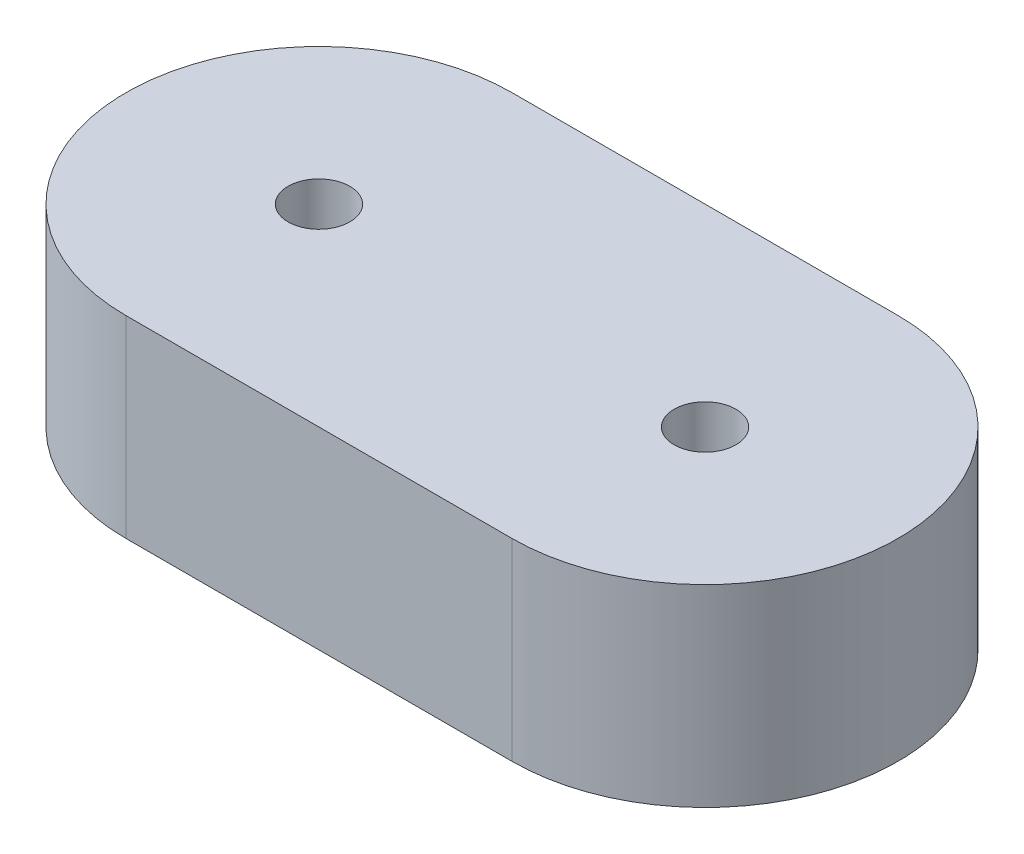
ISO-10303-21;
HEADER;
FILE_DESCRIPTION(('STEP AP214'),'2;1');
FILE_NAME('part.step','',(''),(''),'','','');
FILE_SCHEMA(('AUTOMOTIVE_DESIGN { 1 0 10303 214 1 1 1 1 }'));
ENDSEC;
DATA;
#1=APPLICATION_CONTEXT('core data for automotive mechanical design processes');
#2=APPLICATION_PROTOCOL_DEFINITION('international standard','automotive_design',2000,#1);
#3=PRODUCT_CONTEXT('',#1,'mechanical');
#4=PRODUCT('Part','Part','',(#3));
#5=PRODUCT_RELATED_PRODUCT_CATEGORY('part','',(#4));
#6=PRODUCT_DEFINITION_FORMATION('','',#4);
#7=PRODUCT_DEFINITION_CONTEXT('part definition',#1,'design');
#8=PRODUCT_DEFINITION('design','',#6,#7);
#9=PRODUCT_DEFINITION_SHAPE('','',#8);
#10=(LENGTH_UNIT() NAMED_UNIT(*) SI_UNIT(.MILLI.,.METRE.));
#11=(NAMED_UNIT(*) PLANE_ANGLE_UNIT() SI_UNIT($,.RADIAN.));
#12=(NAMED_UNIT(*) SI_UNIT($,.STERADIAN.) SOLID_ANGLE_UNIT());
#13=UNCERTAINTY_MEASURE_WITH_UNIT(LENGTH_MEASURE(1.E-05),#10,'distance_accuracy_value','');
#14=(GEOMETRIC_REPRESENTATION_CONTEXT(3) GLOBAL_UNCERTAINTY_ASSIGNED_CONTEXT((#13)) GLOBAL_UNIT_ASSIGNED_CONTEXT((#10,
#11,#12)) REPRESENTATION_CONTEXT('',''));
#15=CARTESIAN_POINT('',(0.,0.,0.));
#16=DIRECTION('',(0.,0.,1.));
#17=DIRECTION('',(1.,0.,0.));
#18=AXIS2_PLACEMENT_3D('',#15,#16,#17);
#19=CARTESIAN_POINT('',(-10.,10.,0.));
#20=DIRECTION('',(0.,1.,0.));
#21=DIRECTION('',(0.,0.,1.));
#22=AXIS2_PLACEMENT_3D('',#19,#20,#21);
#23=PLANE('',#22);
#24=CARTESIAN_POINT('',(-10.,10.,0.));
#25=DIRECTION('',(0.,1.,0.));
#26=DIRECTION('',(0.,0.,1.));
#27=AXIS2_PLACEMENT_3D('',#24,#25,#26);
#28=CIRCLE('',#27,1.6);
#29=CARTESIAN_POINT('',(-10.,10.,1.6));
#30=VERTEX_POINT('',#29);
#31=EDGE_CURVE('E120',#30,#30,#28,.T.);
#32=ORIENTED_EDGE('',*,*,#31,.F.);
#33=EDGE_LOOP('',(#32));
#34=FACE_BOUND('',#33,.T.);
#35=CARTESIAN_POINT('',(-10.,10.,0.));
#36=DIRECTION('',(0.,1.,0.));
#37=DIRECTION('',(0.,0.,1.));
#38=AXIS2_PLACEMENT_3D('',#35,#36,#37);
#39=CIRCLE('',#38,10.);
#40=CARTESIAN_POINT('',(-10.,10.,-10.));
#41=VERTEX_POINT('',#40);
#42=CARTESIAN_POINT('',(-10.,10.,10.));
#43=VERTEX_POINT('',#42);
#44=EDGE_CURVE('E100',#41,#43,#39,.T.);
#45=ORIENTED_EDGE('',*,*,#44,.T.);
#46=DIRECTION('',(1.,0.,0.));
#47=VECTOR('',#46,1.);
#48=CARTESIAN_POINT('',(-10.,10.,10.));
#49=LINE('',#48,#47);
#50=CARTESIAN_POINT('',(10.,10.,9.99999999999999));
#51=VERTEX_POINT('',#50);
#52=EDGE_CURVE('E95',#43,#51,#49,.T.);
#53=ORIENTED_EDGE('',*,*,#52,.T.);
#54=CARTESIAN_POINT('',(10.,10.,0.));
#55=DIRECTION('',(0.,1.,0.));
#56=DIRECTION('',(0.,0.,1.));
#57=AXIS2_PLACEMENT_3D('',#54,#55,#56);
#58=CIRCLE('',#57,10.);
#59=CARTESIAN_POINT('',(10.,10.,-10.));
#60=VERTEX_POINT('',#59);
#61=EDGE_CURVE('E98',#51,#60,#58,.T.);
#62=ORIENTED_EDGE('',*,*,#61,.T.);
#63=DIRECTION('',(-1.,0.,0.));
#64=VECTOR('',#63,1.);
#65=CARTESIAN_POINT('',(-10.,10.,-10.));
#66=LINE('',#65,#64);
#67=EDGE_CURVE('E65',#60,#41,#66,.T.);
#68=ORIENTED_EDGE('',*,*,#67,.T.);
#69=EDGE_LOOP('',(#45,#53,#62,#68));
#70=FACE_BOUND('',#69,.T.);
#71=CARTESIAN_POINT('',(10.,10.,0.));
#72=DIRECTION('',(0.,1.,0.));
#73=DIRECTION('',(0.,0.,1.));
#74=AXIS2_PLACEMENT_3D('',#71,#72,#73);
#75=CIRCLE('',#74,1.6);
#76=CARTESIAN_POINT('',(10.,10.,1.6));
#77=VERTEX_POINT('',#76);
#78=EDGE_CURVE('E142',#77,#77,#75,.T.);
#79=ORIENTED_EDGE('',*,*,#78,.F.);
#80=EDGE_LOOP('',(#79));
#81=FACE_BOUND('',#80,.T.);
#82=ADVANCED_FACE('F47',(#34,#70,#81),#23,.T.);
#83=CARTESIAN_POINT('',(-10.,0.,0.));
#84=DIRECTION('',(0.,1.,0.));
#85=DIRECTION('',(0.,0.,1.));
#86=AXIS2_PLACEMENT_3D('',#83,#84,#85);
#87=PLANE('',#86);
#88=CARTESIAN_POINT('',(-10.,0.,0.));
#89=DIRECTION('',(0.,1.,0.));
#90=DIRECTION('',(0.,0.,1.));
#91=AXIS2_PLACEMENT_3D('',#88,#89,#90);
#92=CIRCLE('',#91,10.);
#93=CARTESIAN_POINT('',(-10.,0.,-10.));
#94=VERTEX_POINT('',#93);
#95=CARTESIAN_POINT('',(-10.,0.,10.));
#96=VERTEX_POINT('',#95);
#97=EDGE_CURVE('E116',#94,#96,#92,.T.);
#98=ORIENTED_EDGE('',*,*,#97,.F.);
#99=DIRECTION('',(-1.,0.,0.));
#100=VECTOR('',#99,1.);
#101=CARTESIAN_POINT('',(-10.,0.,-10.));
#102=LINE('',#101,#100);
#103=CARTESIAN_POINT('',(10.,0.,-10.));
#104=VERTEX_POINT('',#103);
#105=EDGE_CURVE('E88',#104,#94,#102,.T.);
#106=ORIENTED_EDGE('',*,*,#105,.F.);
#107=CARTESIAN_POINT('',(10.,0.,0.));
#108=DIRECTION('',(0.,1.,0.));
#109=DIRECTION('',(0.,0.,1.));
#110=AXIS2_PLACEMENT_3D('',#107,#108,#109);
#111=CIRCLE('',#110,10.);
#112=CARTESIAN_POINT('',(10.,0.,9.99999999999999));
#113=VERTEX_POINT('',#112);
#114=EDGE_CURVE('E82',#113,#104,#111,.T.);
#115=ORIENTED_EDGE('',*,*,#114,.F.);
#116=DIRECTION('',(1.,0.,0.));
#117=VECTOR('',#116,1.);
#118=CARTESIAN_POINT('',(-10.,0.,10.));
#119=LINE('',#118,#117);
#120=EDGE_CURVE('E105',#96,#113,#119,.T.);
#121=ORIENTED_EDGE('',*,*,#120,.F.);
#122=EDGE_LOOP('',(#98,#106,#115,#121));
#123=FACE_BOUND('',#122,.T.);
#124=CARTESIAN_POINT('',(-10.,0.,0.));
#125=DIRECTION('',(0.,1.,0.));
#126=DIRECTION('',(0.,0.,1.));
#127=AXIS2_PLACEMENT_3D('',#124,#125,#126);
#128=CIRCLE('',#127,1.6);
#129=CARTESIAN_POINT('',(-10.,0.,1.6));
#130=VERTEX_POINT('',#129);
#131=EDGE_CURVE('E138',#130,#130,#128,.T.);
#132=ORIENTED_EDGE('',*,*,#131,.T.);
#133=EDGE_LOOP('',(#132));
#134=FACE_BOUND('',#133,.T.);
#135=CARTESIAN_POINT('',(10.,0.,0.));
#136=DIRECTION('',(0.,1.,0.));
#137=DIRECTION('',(0.,0.,1.));
#138=AXIS2_PLACEMENT_3D('',#135,#136,#137);
#139=CIRCLE('',#138,1.6);
#140=CARTESIAN_POINT('',(10.,0.,1.6));
#141=VERTEX_POINT('',#140);
#142=EDGE_CURVE('E146',#141,#141,#139,.T.);
#143=ORIENTED_EDGE('',*,*,#142,.T.);
#144=EDGE_LOOP('',(#143));
#145=FACE_BOUND('',#144,.T.);
#146=ADVANCED_FACE('F133',(#123,#134,#145),#87,.F.);
#147=CARTESIAN_POINT('',(-10.,10.,0.));
#148=DIRECTION('',(0.,-1.,0.));
#149=DIRECTION('',(0.,0.,-1.));
#150=AXIS2_PLACEMENT_3D('',#147,#148,#149);
#151=CYLINDRICAL_SURFACE('',#150,10.);
#152=ORIENTED_EDGE('',*,*,#97,.T.);
#153=DIRECTION('',(0.,-1.,0.));
#154=VECTOR('',#153,1.);
#155=CARTESIAN_POINT('',(-10.,10.,10.));
#156=LINE('',#155,#154);
#157=EDGE_CURVE('E11',#43,#96,#156,.T.);
#158=ORIENTED_EDGE('',*,*,#157,.F.);
#159=ORIENTED_EDGE('',*,*,#44,.F.);
#160=DIRECTION('',(0.,-1.,0.));
#161=VECTOR('',#160,1.);
#162=CARTESIAN_POINT('',(-10.,10.,-10.));
#163=LINE('',#162,#161);
#164=EDGE_CURVE('E112',#41,#94,#163,.T.);
#165=ORIENTED_EDGE('',*,*,#164,.T.);
#166=EDGE_LOOP('',(#152,#158,#159,#165));
#167=FACE_BOUND('',#166,.T.);
#168=ADVANCED_FACE('F49',(#167),#151,.T.);
#169=CARTESIAN_POINT('',(-10.,10.,10.));
#170=DIRECTION('',(0.,0.,-1.));
#171=DIRECTION('',(-1.,0.,0.));
#172=AXIS2_PLACEMENT_3D('',#169,#170,#171);
#173=PLANE('',#172);
#174=ORIENTED_EDGE('',*,*,#120,.T.);
#175=DIRECTION('',(0.,-1.,0.));
#176=VECTOR('',#175,1.);
#177=CARTESIAN_POINT('',(10.,10.,9.99999999999999));
#178=LINE('',#177,#176);
#179=EDGE_CURVE('E57',#51,#113,#178,.T.);
#180=ORIENTED_EDGE('',*,*,#179,.F.);
#181=ORIENTED_EDGE('',*,*,#52,.F.);
#182=ORIENTED_EDGE('',*,*,#157,.T.);
#183=EDGE_LOOP('',(#174,#180,#181,#182));
#184=FACE_BOUND('',#183,.T.);
#185=ADVANCED_FACE('F104',(#184),#173,.F.);
#186=CARTESIAN_POINT('',(10.,10.,0.));
#187=DIRECTION('',(0.,-1.,0.));
#188=DIRECTION('',(0.,0.,-1.));
#189=AXIS2_PLACEMENT_3D('',#186,#187,#188);
#190=CYLINDRICAL_SURFACE('',#189,10.);
#191=ORIENTED_EDGE('',*,*,#114,.T.);
#192=DIRECTION('',(0.,-1.,0.));
#193=VECTOR('',#192,1.);
#194=CARTESIAN_POINT('',(10.,10.,-10.));
#195=LINE('',#194,#193);
#196=EDGE_CURVE('E107',#60,#104,#195,.T.);
#197=ORIENTED_EDGE('',*,*,#196,.F.);
#198=ORIENTED_EDGE('',*,*,#61,.F.);
#199=ORIENTED_EDGE('',*,*,#179,.T.);
#200=EDGE_LOOP('',(#191,#197,#198,#199));
#201=FACE_BOUND('',#200,.T.);
#202=ADVANCED_FACE('F108',(#201),#190,.T.);
#203=CARTESIAN_POINT('',(-10.,10.,-10.));
#204=DIRECTION('',(0.,0.,1.));
#205=DIRECTION('',(1.,0.,0.));
#206=AXIS2_PLACEMENT_3D('',#203,#204,#205);
#207=PLANE('',#206);
#208=ORIENTED_EDGE('',*,*,#105,.T.);
#209=ORIENTED_EDGE('',*,*,#164,.F.);
#210=ORIENTED_EDGE('',*,*,#67,.F.);
#211=ORIENTED_EDGE('',*,*,#196,.T.);
#212=EDGE_LOOP('',(#208,#209,#210,#211));
#213=FACE_BOUND('',#212,.T.);
#214=ADVANCED_FACE('F130',(#213),#207,.F.);
#215=CARTESIAN_POINT('',(-10.,10.,0.));
#216=DIRECTION('',(0.,-1.,0.));
#217=DIRECTION('',(0.,0.,-1.));
#218=AXIS2_PLACEMENT_3D('',#215,#216,#217);
#219=CYLINDRICAL_SURFACE('',#218,1.6);
#220=ORIENTED_EDGE('',*,*,#31,.T.);
#221=EDGE_LOOP('',(#220));
#222=FACE_BOUND('',#221,.T.);
#223=ORIENTED_EDGE('',*,*,#131,.F.);
#224=EDGE_LOOP('',(#223));
#225=FACE_BOUND('',#224,.T.);
#226=ADVANCED_FACE('F165',(#222,#225),#219,.F.);
#227=CARTESIAN_POINT('',(10.,10.,0.));
#228=DIRECTION('',(0.,-1.,0.));
#229=DIRECTION('',(0.,0.,-1.));
#230=AXIS2_PLACEMENT_3D('',#227,#228,#229);
#231=CYLINDRICAL_SURFACE('',#230,1.6);
#232=ORIENTED_EDGE('',*,*,#78,.T.);
#233=EDGE_LOOP('',(#232));
#234=FACE_BOUND('',#233,.T.);
#235=ORIENTED_EDGE('',*,*,#142,.F.);
#236=EDGE_LOOP('',(#235));
#237=FACE_BOUND('',#236,.T.);
#238=ADVANCED_FACE('F154',(#234,#237),#231,.F.);
#239=CLOSED_SHELL('',(#82,#146,#168,#185,#202,#214,#226,#238));
#240=MANIFOLD_SOLID_BREP('B2',#239);
#241=ADVANCED_BREP_SHAPE_REPRESENTATION('',(#18,#240),#14);
#242=SHAPE_DEFINITION_REPRESENTATION(#9,#241);
ENDSEC;
END-ISO-10303-21;
